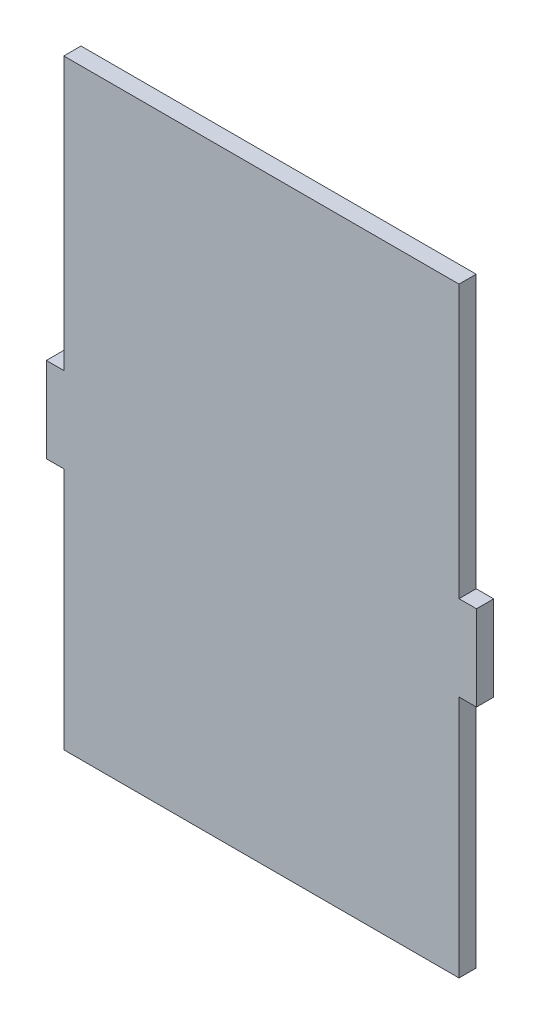
ISO-10303-21;
HEADER;
FILE_DESCRIPTION(('STEP AP214'),'2;1');
FILE_NAME('part.step','',(''),(''),'','','');
FILE_SCHEMA(('AUTOMOTIVE_DESIGN { 1 0 10303 214 1 1 1 1 }'));
ENDSEC;
DATA;
#1=APPLICATION_CONTEXT('core data for automotive mechanical design processes');
#2=APPLICATION_PROTOCOL_DEFINITION('international standard','automotive_design',2000,#1);
#3=PRODUCT_CONTEXT('',#1,'mechanical');
#4=PRODUCT('Part','Part','',(#3));
#5=PRODUCT_RELATED_PRODUCT_CATEGORY('part','',(#4));
#6=PRODUCT_DEFINITION_FORMATION('','',#4);
#7=PRODUCT_DEFINITION_CONTEXT('part definition',#1,'design');
#8=PRODUCT_DEFINITION('design','',#6,#7);
#9=PRODUCT_DEFINITION_SHAPE('','',#8);
#10=(LENGTH_UNIT() NAMED_UNIT(*) SI_UNIT(.MILLI.,.METRE.));
#11=(NAMED_UNIT(*) PLANE_ANGLE_UNIT() SI_UNIT($,.RADIAN.));
#12=(NAMED_UNIT(*) SI_UNIT($,.STERADIAN.) SOLID_ANGLE_UNIT());
#13=UNCERTAINTY_MEASURE_WITH_UNIT(LENGTH_MEASURE(1.E-05),#10,'distance_accuracy_value','');
#14=(GEOMETRIC_REPRESENTATION_CONTEXT(3) GLOBAL_UNCERTAINTY_ASSIGNED_CONTEXT((#13)) GLOBAL_UNIT_ASSIGNED_CONTEXT((#10,
#11,#12)) REPRESENTATION_CONTEXT('',''));
#15=CARTESIAN_POINT('',(0.,0.,0.));
#16=DIRECTION('',(0.,0.,1.));
#17=DIRECTION('',(1.,0.,0.));
#18=AXIS2_PLACEMENT_3D('',#15,#16,#17);
#19=CARTESIAN_POINT('',(0.,0.,2.));
#20=DIRECTION('',(1.,0.,0.));
#21=DIRECTION('',(0.,1.,0.));
#22=AXIS2_PLACEMENT_3D('',#19,#20,#21);
#23=PLANE('',#22);
#24=DIRECTION('',(0.,0.,-1.));
#25=VECTOR('',#24,1.);
#26=CARTESIAN_POINT('',(0.,-89.902,10.));
#27=LINE('',#26,#25);
#28=CARTESIAN_POINT('',(0.,-89.902,2.));
#29=VERTEX_POINT('',#28);
#30=CARTESIAN_POINT('',(0.,-89.902,0.));
#31=VERTEX_POINT('',#30);
#32=EDGE_CURVE('E228',#29,#31,#27,.T.);
#33=ORIENTED_EDGE('',*,*,#32,.T.);
#34=DIRECTION('',(0.,-1.,0.));
#35=VECTOR('',#34,1.);
#36=CARTESIAN_POINT('',(0.,0.,0.));
#37=LINE('',#36,#35);
#38=CARTESIAN_POINT('',(0.,-61.595,0.));
#39=VERTEX_POINT('',#38);
#40=EDGE_CURVE('E201',#39,#31,#37,.T.);
#41=ORIENTED_EDGE('',*,*,#40,.F.);
#42=DIRECTION('',(0.,0.,-1.));
#43=VECTOR('',#42,1.);
#44=CARTESIAN_POINT('',(0.,-61.595,2.));
#45=LINE('',#44,#43);
#46=CARTESIAN_POINT('',(0.,-61.595,2.));
#47=VERTEX_POINT('',#46);
#48=EDGE_CURVE('E11',#47,#39,#45,.T.);
#49=ORIENTED_EDGE('',*,*,#48,.F.);
#50=DIRECTION('',(0.,-1.,0.));
#51=VECTOR('',#50,1.);
#52=CARTESIAN_POINT('',(0.,0.,2.));
#53=LINE('',#52,#51);
#54=EDGE_CURVE('E165',#47,#29,#53,.T.);
#55=ORIENTED_EDGE('',*,*,#54,.T.);
#56=EDGE_LOOP('',(#33,#41,#49,#55));
#57=FACE_BOUND('',#56,.T.);
#58=ADVANCED_FACE('F44',(#57),#23,.T.);
#59=CARTESIAN_POINT('',(0.,-61.595,2.));
#60=DIRECTION('',(0.,1.,0.));
#61=DIRECTION('',(0.,0.,1.));
#62=AXIS2_PLACEMENT_3D('',#59,#60,#61);
#63=PLANE('',#62);
#64=DIRECTION('',(1.,0.,0.));
#65=VECTOR('',#64,1.);
#66=CARTESIAN_POINT('',(0.,-61.595,0.));
#67=LINE('',#66,#65);
#68=CARTESIAN_POINT('',(2.03200000000001,-61.595,0.));
#69=VERTEX_POINT('',#68);
#70=EDGE_CURVE('E197',#39,#69,#67,.T.);
#71=ORIENTED_EDGE('',*,*,#70,.T.);
#72=DIRECTION('',(0.,0.,-1.));
#73=VECTOR('',#72,1.);
#74=CARTESIAN_POINT('',(2.03200000000001,-61.595,2.));
#75=LINE('',#74,#73);
#76=CARTESIAN_POINT('',(2.03200000000001,-61.595,2.));
#77=VERTEX_POINT('',#76);
#78=EDGE_CURVE('E51',#77,#69,#75,.T.);
#79=ORIENTED_EDGE('',*,*,#78,.F.);
#80=DIRECTION('',(1.,0.,0.));
#81=VECTOR('',#80,1.);
#82=CARTESIAN_POINT('',(0.,-61.595,2.));
#83=LINE('',#82,#81);
#84=EDGE_CURVE('E221',#47,#77,#83,.T.);
#85=ORIENTED_EDGE('',*,*,#84,.F.);
#86=ORIENTED_EDGE('',*,*,#48,.T.);
#87=EDGE_LOOP('',(#71,#79,#85,#86));
#88=FACE_BOUND('',#87,.T.);
#89=ADVANCED_FACE('F261',(#88),#63,.F.);
#90=CARTESIAN_POINT('',(2.03200000000001,0.,2.));
#91=DIRECTION('',(-1.,0.,0.));
#92=DIRECTION('',(0.,0.,1.));
#93=AXIS2_PLACEMENT_3D('',#90,#91,#92);
#94=PLANE('',#93);
#95=DIRECTION('',(0.,1.,0.));
#96=VECTOR('',#95,1.);
#97=CARTESIAN_POINT('',(2.03200000000001,0.,0.));
#98=LINE('',#97,#96);
#99=CARTESIAN_POINT('',(2.03200000000001,-51.689,0.));
#100=VERTEX_POINT('',#99);
#101=EDGE_CURVE('E190',#69,#100,#98,.T.);
#102=ORIENTED_EDGE('',*,*,#101,.T.);
#103=DIRECTION('',(0.,0.,-1.));
#104=VECTOR('',#103,1.);
#105=CARTESIAN_POINT('',(2.03200000000001,-51.689,2.));
#106=LINE('',#105,#104);
#107=CARTESIAN_POINT('',(2.03200000000001,-51.689,2.));
#108=VERTEX_POINT('',#107);
#109=EDGE_CURVE('E181',#108,#100,#106,.T.);
#110=ORIENTED_EDGE('',*,*,#109,.F.);
#111=DIRECTION('',(0.,1.,0.));
#112=VECTOR('',#111,1.);
#113=CARTESIAN_POINT('',(2.03200000000001,0.,2.));
#114=LINE('',#113,#112);
#115=EDGE_CURVE('E192',#77,#108,#114,.T.);
#116=ORIENTED_EDGE('',*,*,#115,.F.);
#117=ORIENTED_EDGE('',*,*,#78,.T.);
#118=EDGE_LOOP('',(#102,#110,#116,#117));
#119=FACE_BOUND('',#118,.T.);
#120=ADVANCED_FACE('F188',(#119),#94,.F.);
#121=CARTESIAN_POINT('',(0.,-51.689,2.));
#122=DIRECTION('',(0.,1.,0.));
#123=DIRECTION('',(0.,0.,1.));
#124=AXIS2_PLACEMENT_3D('',#121,#122,#123);
#125=PLANE('',#124);
#126=DIRECTION('',(1.,0.,0.));
#127=VECTOR('',#126,1.);
#128=CARTESIAN_POINT('',(0.,-51.689,0.));
#129=LINE('',#128,#127);
#130=CARTESIAN_POINT('',(0.,-51.689,0.));
#131=VERTEX_POINT('',#130);
#132=EDGE_CURVE('E155',#131,#100,#129,.T.);
#133=ORIENTED_EDGE('',*,*,#132,.F.);
#134=DIRECTION('',(0.,0.,-1.));
#135=VECTOR('',#134,1.);
#136=CARTESIAN_POINT('',(0.,-51.689,2.));
#137=LINE('',#136,#135);
#138=CARTESIAN_POINT('',(0.,-51.689,2.));
#139=VERTEX_POINT('',#138);
#140=EDGE_CURVE('E178',#139,#131,#137,.T.);
#141=ORIENTED_EDGE('',*,*,#140,.F.);
#142=DIRECTION('',(1.,0.,0.));
#143=VECTOR('',#142,1.);
#144=CARTESIAN_POINT('',(0.,-51.689,2.));
#145=LINE('',#144,#143);
#146=EDGE_CURVE('E217',#139,#108,#145,.T.);
#147=ORIENTED_EDGE('',*,*,#146,.T.);
#148=ORIENTED_EDGE('',*,*,#109,.T.);
#149=EDGE_LOOP('',(#133,#141,#147,#148));
#150=FACE_BOUND('',#149,.T.);
#151=ADVANCED_FACE('F260',(#150),#125,.T.);
#152=CARTESIAN_POINT('',(0.,0.,2.));
#153=DIRECTION('',(1.,0.,0.));
#154=DIRECTION('',(0.,1.,0.));
#155=AXIS2_PLACEMENT_3D('',#152,#153,#154);
#156=PLANE('',#155);
#157=DIRECTION('',(0.,0.,-1.));
#158=VECTOR('',#157,1.);
#159=CARTESIAN_POINT('',(0.,-20.,10.));
#160=LINE('',#159,#158);
#161=CARTESIAN_POINT('',(0.,-20.,2.));
#162=VERTEX_POINT('',#161);
#163=CARTESIAN_POINT('',(0.,-20.,0.));
#164=VERTEX_POINT('',#163);
#165=EDGE_CURVE('E58',#162,#164,#160,.T.);
#166=ORIENTED_EDGE('',*,*,#165,.F.);
#167=DIRECTION('',(0.,-1.,0.));
#168=VECTOR('',#167,1.);
#169=CARTESIAN_POINT('',(0.,0.,2.));
#170=LINE('',#169,#168);
#171=EDGE_CURVE('E215',#162,#139,#170,.T.);
#172=ORIENTED_EDGE('',*,*,#171,.T.);
#173=ORIENTED_EDGE('',*,*,#140,.T.);
#174=DIRECTION('',(0.,-1.,0.));
#175=VECTOR('',#174,1.);
#176=CARTESIAN_POINT('',(0.,0.,0.));
#177=LINE('',#176,#175);
#178=EDGE_CURVE('E151',#164,#131,#177,.T.);
#179=ORIENTED_EDGE('',*,*,#178,.F.);
#180=EDGE_LOOP('',(#166,#172,#173,#179));
#181=FACE_BOUND('',#180,.T.);
#182=ADVANCED_FACE('F257',(#181),#156,.T.);
#183=CARTESIAN_POINT('',(-45.974,0.,2.));
#184=DIRECTION('',(1.,0.,0.));
#185=DIRECTION('',(0.,1.,0.));
#186=AXIS2_PLACEMENT_3D('',#183,#184,#185);
#187=PLANE('',#186);
#188=DIRECTION('',(0.,-1.,0.));
#189=VECTOR('',#188,1.);
#190=CARTESIAN_POINT('',(-45.974,0.,2.));
#191=LINE('',#190,#189);
#192=CARTESIAN_POINT('',(-45.974,-20.,2.));
#193=VERTEX_POINT('',#192);
#194=CARTESIAN_POINT('',(-45.974,-51.689,2.));
#195=VERTEX_POINT('',#194);
#196=EDGE_CURVE('E144',#193,#195,#191,.T.);
#197=ORIENTED_EDGE('',*,*,#196,.F.);
#198=DIRECTION('',(0.,0.,-1.));
#199=VECTOR('',#198,1.);
#200=CARTESIAN_POINT('',(-45.974,-20.,10.));
#201=LINE('',#200,#199);
#202=CARTESIAN_POINT('',(-45.974,-20.,0.));
#203=VERTEX_POINT('',#202);
#204=EDGE_CURVE('E131',#193,#203,#201,.T.);
#205=ORIENTED_EDGE('',*,*,#204,.T.);
#206=DIRECTION('',(0.,-1.,0.));
#207=VECTOR('',#206,1.);
#208=CARTESIAN_POINT('',(-45.974,0.,0.));
#209=LINE('',#208,#207);
#210=CARTESIAN_POINT('',(-45.974,-51.689,0.));
#211=VERTEX_POINT('',#210);
#212=EDGE_CURVE('E142',#203,#211,#209,.T.);
#213=ORIENTED_EDGE('',*,*,#212,.T.);
#214=DIRECTION('',(0.,0.,-1.));
#215=VECTOR('',#214,1.);
#216=CARTESIAN_POINT('',(-45.974,-51.689,2.));
#217=LINE('',#216,#215);
#218=EDGE_CURVE('E176',#195,#211,#217,.T.);
#219=ORIENTED_EDGE('',*,*,#218,.F.);
#220=EDGE_LOOP('',(#197,#205,#213,#219));
#221=FACE_BOUND('',#220,.T.);
#222=ADVANCED_FACE('F140',(#221),#187,.F.);
#223=CARTESIAN_POINT('',(0.,-51.689,2.));
#224=DIRECTION('',(0.,-1.,0.));
#225=DIRECTION('',(0.,0.,-1.));
#226=AXIS2_PLACEMENT_3D('',#223,#224,#225);
#227=PLANE('',#226);
#228=DIRECTION('',(-1.,0.,0.));
#229=VECTOR('',#228,1.);
#230=CARTESIAN_POINT('',(0.,-51.689,0.));
#231=LINE('',#230,#229);
#232=CARTESIAN_POINT('',(-48.006,-51.689,0.));
#233=VERTEX_POINT('',#232);
#234=EDGE_CURVE('E150',#211,#233,#231,.T.);
#235=ORIENTED_EDGE('',*,*,#234,.T.);
#236=DIRECTION('',(0.,0.,-1.));
#237=VECTOR('',#236,1.);
#238=CARTESIAN_POINT('',(-48.006,-51.689,2.));
#239=LINE('',#238,#237);
#240=CARTESIAN_POINT('',(-48.006,-51.689,2.));
#241=VERTEX_POINT('',#240);
#242=EDGE_CURVE('E173',#241,#233,#239,.T.);
#243=ORIENTED_EDGE('',*,*,#242,.F.);
#244=DIRECTION('',(-1.,0.,0.));
#245=VECTOR('',#244,1.);
#246=CARTESIAN_POINT('',(0.,-51.689,2.));
#247=LINE('',#246,#245);
#248=EDGE_CURVE('E212',#195,#241,#247,.T.);
#249=ORIENTED_EDGE('',*,*,#248,.F.);
#250=ORIENTED_EDGE('',*,*,#218,.T.);
#251=EDGE_LOOP('',(#235,#243,#249,#250));
#252=FACE_BOUND('',#251,.T.);
#253=ADVANCED_FACE('F251',(#252),#227,.F.);
#254=CARTESIAN_POINT('',(-48.006,0.,2.));
#255=DIRECTION('',(1.,0.,0.));
#256=DIRECTION('',(0.,0.,-1.));
#257=AXIS2_PLACEMENT_3D('',#254,#255,#256);
#258=PLANE('',#257);
#259=DIRECTION('',(0.,-1.,0.));
#260=VECTOR('',#259,1.);
#261=CARTESIAN_POINT('',(-48.006,0.,0.));
#262=LINE('',#261,#260);
#263=CARTESIAN_POINT('',(-48.006,-61.595,0.));
#264=VERTEX_POINT('',#263);
#265=EDGE_CURVE('E153',#233,#264,#262,.T.);
#266=ORIENTED_EDGE('',*,*,#265,.T.);
#267=DIRECTION('',(0.,0.,-1.));
#268=VECTOR('',#267,1.);
#269=CARTESIAN_POINT('',(-48.006,-61.595,2.));
#270=LINE('',#269,#268);
#271=CARTESIAN_POINT('',(-48.006,-61.595,2.));
#272=VERTEX_POINT('',#271);
#273=EDGE_CURVE('E169',#272,#264,#270,.T.);
#274=ORIENTED_EDGE('',*,*,#273,.F.);
#275=DIRECTION('',(0.,-1.,0.));
#276=VECTOR('',#275,1.);
#277=CARTESIAN_POINT('',(-48.006,0.,2.));
#278=LINE('',#277,#276);
#279=EDGE_CURVE('E210',#241,#272,#278,.T.);
#280=ORIENTED_EDGE('',*,*,#279,.F.);
#281=ORIENTED_EDGE('',*,*,#242,.T.);
#282=EDGE_LOOP('',(#266,#274,#280,#281));
#283=FACE_BOUND('',#282,.T.);
#284=ADVANCED_FACE('F246',(#283),#258,.F.);
#285=CARTESIAN_POINT('',(0.,-61.595,2.));
#286=DIRECTION('',(0.,1.,0.));
#287=DIRECTION('',(0.,0.,1.));
#288=AXIS2_PLACEMENT_3D('',#285,#286,#287);
#289=PLANE('',#288);
#290=DIRECTION('',(1.,0.,0.));
#291=VECTOR('',#290,1.);
#292=CARTESIAN_POINT('',(0.,-61.595,0.));
#293=LINE('',#292,#291);
#294=CARTESIAN_POINT('',(-45.974,-61.595,0.));
#295=VERTEX_POINT('',#294);
#296=EDGE_CURVE('E160',#264,#295,#293,.T.);
#297=ORIENTED_EDGE('',*,*,#296,.T.);
#298=DIRECTION('',(0.,0.,-1.));
#299=VECTOR('',#298,1.);
#300=CARTESIAN_POINT('',(-45.974,-61.595,2.));
#301=LINE('',#300,#299);
#302=CARTESIAN_POINT('',(-45.974,-61.595,2.));
#303=VERTEX_POINT('',#302);
#304=EDGE_CURVE('E166',#303,#295,#301,.T.);
#305=ORIENTED_EDGE('',*,*,#304,.F.);
#306=DIRECTION('',(1.,0.,0.));
#307=VECTOR('',#306,1.);
#308=CARTESIAN_POINT('',(0.,-61.595,2.));
#309=LINE('',#308,#307);
#310=EDGE_CURVE('E207',#272,#303,#309,.T.);
#311=ORIENTED_EDGE('',*,*,#310,.F.);
#312=ORIENTED_EDGE('',*,*,#273,.T.);
#313=EDGE_LOOP('',(#297,#305,#311,#312));
#314=FACE_BOUND('',#313,.T.);
#315=ADVANCED_FACE('F243',(#314),#289,.F.);
#316=CARTESIAN_POINT('',(-45.974,0.,2.));
#317=DIRECTION('',(-1.,0.,0.));
#318=DIRECTION('',(0.,0.,1.));
#319=AXIS2_PLACEMENT_3D('',#316,#317,#318);
#320=PLANE('',#319);
#321=DIRECTION('',(0.,0.,-1.));
#322=VECTOR('',#321,1.);
#323=CARTESIAN_POINT('',(-45.974,-89.902,10.));
#324=LINE('',#323,#322);
#325=CARTESIAN_POINT('',(-45.974,-89.902,2.));
#326=VERTEX_POINT('',#325);
#327=CARTESIAN_POINT('',(-45.974,-89.902,0.));
#328=VERTEX_POINT('',#327);
#329=EDGE_CURVE('E66',#326,#328,#324,.T.);
#330=ORIENTED_EDGE('',*,*,#329,.F.);
#331=DIRECTION('',(0.,1.,0.));
#332=VECTOR('',#331,1.);
#333=CARTESIAN_POINT('',(-45.974,0.,2.));
#334=LINE('',#333,#332);
#335=EDGE_CURVE('E170',#326,#303,#334,.T.);
#336=ORIENTED_EDGE('',*,*,#335,.T.);
#337=ORIENTED_EDGE('',*,*,#304,.T.);
#338=DIRECTION('',(0.,1.,0.));
#339=VECTOR('',#338,1.);
#340=CARTESIAN_POINT('',(-45.974,0.,0.));
#341=LINE('',#340,#339);
#342=EDGE_CURVE('E163',#328,#295,#341,.T.);
#343=ORIENTED_EDGE('',*,*,#342,.F.);
#344=EDGE_LOOP('',(#330,#336,#337,#343));
#345=FACE_BOUND('',#344,.T.);
#346=ADVANCED_FACE('F238',(#345),#320,.T.);
#347=CARTESIAN_POINT('',(0.,0.,2.));
#348=DIRECTION('',(0.,0.,1.));
#349=DIRECTION('',(1.,0.,0.));
#350=AXIS2_PLACEMENT_3D('',#347,#348,#349);
#351=PLANE('',#350);
#352=DIRECTION('',(1.,0.,0.));
#353=VECTOR('',#352,1.);
#354=CARTESIAN_POINT('',(0.,-20.,2.));
#355=LINE('',#354,#353);
#356=EDGE_CURVE('E205',#193,#162,#355,.T.);
#357=ORIENTED_EDGE('',*,*,#356,.F.);
#358=ORIENTED_EDGE('',*,*,#196,.T.);
#359=ORIENTED_EDGE('',*,*,#248,.T.);
#360=ORIENTED_EDGE('',*,*,#279,.T.);
#361=ORIENTED_EDGE('',*,*,#310,.T.);
#362=ORIENTED_EDGE('',*,*,#335,.F.);
#363=DIRECTION('',(-1.,0.,0.));
#364=VECTOR('',#363,1.);
#365=CARTESIAN_POINT('',(0.,-89.902,2.));
#366=LINE('',#365,#364);
#367=EDGE_CURVE('E145',#29,#326,#366,.T.);
#368=ORIENTED_EDGE('',*,*,#367,.F.);
#369=ORIENTED_EDGE('',*,*,#54,.F.);
#370=ORIENTED_EDGE('',*,*,#84,.T.);
#371=ORIENTED_EDGE('',*,*,#115,.T.);
#372=ORIENTED_EDGE('',*,*,#146,.F.);
#373=ORIENTED_EDGE('',*,*,#171,.F.);
#374=EDGE_LOOP('',(#357,#358,#359,#360,#361,#362,#368,#369,#370,#371,#372,#373));
#375=FACE_BOUND('',#374,.T.);
#376=ADVANCED_FACE('F253',(#375),#351,.T.);
#377=CARTESIAN_POINT('',(0.,0.,0.));
#378=DIRECTION('',(0.,0.,1.));
#379=DIRECTION('',(1.,0.,0.));
#380=AXIS2_PLACEMENT_3D('',#377,#378,#379);
#381=PLANE('',#380);
#382=ORIENTED_EDGE('',*,*,#212,.F.);
#383=DIRECTION('',(-1.,0.,0.));
#384=VECTOR('',#383,1.);
#385=CARTESIAN_POINT('',(-45.974,-20.,0.));
#386=LINE('',#385,#384);
#387=EDGE_CURVE('E128',#164,#203,#386,.T.);
#388=ORIENTED_EDGE('',*,*,#387,.F.);
#389=ORIENTED_EDGE('',*,*,#178,.T.);
#390=ORIENTED_EDGE('',*,*,#132,.T.);
#391=ORIENTED_EDGE('',*,*,#101,.F.);
#392=ORIENTED_EDGE('',*,*,#70,.F.);
#393=ORIENTED_EDGE('',*,*,#40,.T.);
#394=DIRECTION('',(1.,0.,0.));
#395=VECTOR('',#394,1.);
#396=CARTESIAN_POINT('',(0.,-89.902,0.));
#397=LINE('',#396,#395);
#398=EDGE_CURVE('E136',#328,#31,#397,.T.);
#399=ORIENTED_EDGE('',*,*,#398,.F.);
#400=ORIENTED_EDGE('',*,*,#342,.T.);
#401=ORIENTED_EDGE('',*,*,#296,.F.);
#402=ORIENTED_EDGE('',*,*,#265,.F.);
#403=ORIENTED_EDGE('',*,*,#234,.F.);
#404=EDGE_LOOP('',(#382,#388,#389,#390,#391,#392,#393,#399,#400,#401,#402,#403));
#405=FACE_BOUND('',#404,.T.);
#406=ADVANCED_FACE('F148',(#405),#381,.F.);
#407=CARTESIAN_POINT('',(0.,-89.902,10.));
#408=DIRECTION('',(0.,1.,0.));
#409=DIRECTION('',(0.,0.,1.));
#410=AXIS2_PLACEMENT_3D('',#407,#408,#409);
#411=PLANE('',#410);
#412=ORIENTED_EDGE('',*,*,#367,.T.);
#413=ORIENTED_EDGE('',*,*,#329,.T.);
#414=ORIENTED_EDGE('',*,*,#398,.T.);
#415=ORIENTED_EDGE('',*,*,#32,.F.);
#416=EDGE_LOOP('',(#412,#413,#414,#415));
#417=FACE_BOUND('',#416,.T.);
#418=ADVANCED_FACE('F285',(#417),#411,.F.);
#419=CARTESIAN_POINT('',(-45.974,-20.,10.));
#420=DIRECTION('',(0.,-1.,0.));
#421=DIRECTION('',(0.,0.,-1.));
#422=AXIS2_PLACEMENT_3D('',#419,#420,#421);
#423=PLANE('',#422);
#424=ORIENTED_EDGE('',*,*,#356,.T.);
#425=ORIENTED_EDGE('',*,*,#165,.T.);
#426=ORIENTED_EDGE('',*,*,#387,.T.);
#427=ORIENTED_EDGE('',*,*,#204,.F.);
#428=EDGE_LOOP('',(#424,#425,#426,#427));
#429=FACE_BOUND('',#428,.T.);
#430=ADVANCED_FACE('F130',(#429),#423,.F.);
#431=CLOSED_SHELL('',(#58,#89,#120,#151,#182,#222,#253,#284,#315,#346,#376,#406,#418,#430));
#432=MANIFOLD_SOLID_BREP('B2',#431);
#433=ADVANCED_BREP_SHAPE_REPRESENTATION('',(#18,#432),#14);
#434=SHAPE_DEFINITION_REPRESENTATION(#9,#433);
ENDSEC;
END-ISO-10303-21;
